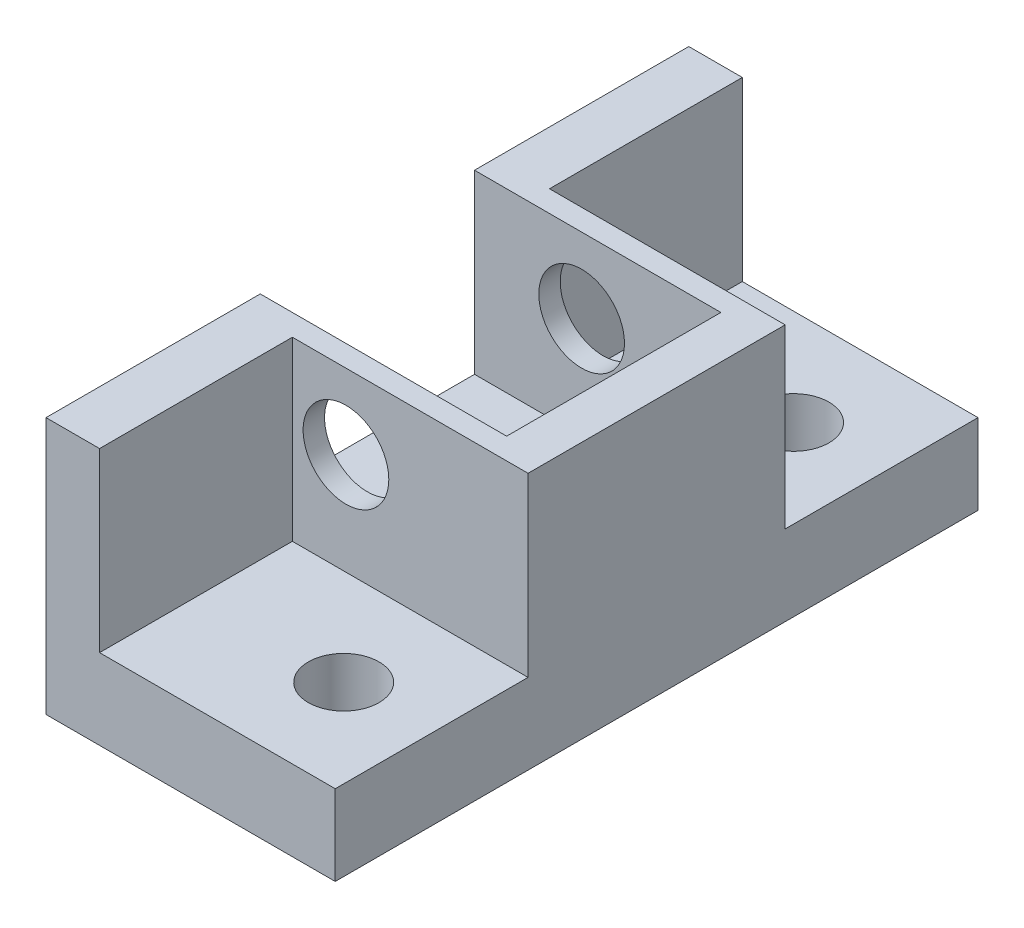
ISO-10303-21;
HEADER;
FILE_DESCRIPTION(('STEP AP214'),'2;1');
FILE_NAME('part.step','',(''),(''),'','','');
FILE_SCHEMA(('AUTOMOTIVE_DESIGN { 1 0 10303 214 1 1 1 1 }'));
ENDSEC;
DATA;
#1=APPLICATION_CONTEXT('core data for automotive mechanical design processes');
#2=APPLICATION_PROTOCOL_DEFINITION('international standard','automotive_design',2000,#1);
#3=PRODUCT_CONTEXT('',#1,'mechanical');
#4=PRODUCT('Part','Part','',(#3));
#5=PRODUCT_RELATED_PRODUCT_CATEGORY('part','',(#4));
#6=PRODUCT_DEFINITION_FORMATION('','',#4);
#7=PRODUCT_DEFINITION_CONTEXT('part definition',#1,'design');
#8=PRODUCT_DEFINITION('design','',#6,#7);
#9=PRODUCT_DEFINITION_SHAPE('','',#8);
#10=(LENGTH_UNIT() NAMED_UNIT(*) SI_UNIT(.MILLI.,.METRE.));
#11=(NAMED_UNIT(*) PLANE_ANGLE_UNIT() SI_UNIT($,.RADIAN.));
#12=(NAMED_UNIT(*) SI_UNIT($,.STERADIAN.) SOLID_ANGLE_UNIT());
#13=UNCERTAINTY_MEASURE_WITH_UNIT(LENGTH_MEASURE(1.E-05),#10,'distance_accuracy_value','');
#14=(GEOMETRIC_REPRESENTATION_CONTEXT(3) GLOBAL_UNCERTAINTY_ASSIGNED_CONTEXT((#13)) GLOBAL_UNIT_ASSIGNED_CONTEXT((#10,
#11,#12)) REPRESENTATION_CONTEXT('',''));
#15=CARTESIAN_POINT('',(0.,0.,0.));
#16=DIRECTION('',(0.,0.,1.));
#17=DIRECTION('',(1.,0.,0.));
#18=AXIS2_PLACEMENT_3D('',#15,#16,#17);
#19=CARTESIAN_POINT('',(0.,7.5,0.));
#20=DIRECTION('',(0.,1.,0.));
#21=DIRECTION('',(0.,0.,1.));
#22=AXIS2_PLACEMENT_3D('',#19,#20,#21);
#23=PLANE('',#22);
#24=DIRECTION('',(-1.,0.,0.));
#25=VECTOR('',#24,1.);
#26=CARTESIAN_POINT('',(9.50000000000001,7.5,9.99999999999999));
#27=LINE('',#26,#25);
#28=CARTESIAN_POINT('',(9.50000000000001,7.5,9.99999999999999));
#29=VERTEX_POINT('',#28);
#30=CARTESIAN_POINT('',(-13.5,7.5,9.99999999999999));
#31=VERTEX_POINT('',#30);
#32=EDGE_CURVE('E56',#29,#31,#27,.T.);
#33=ORIENTED_EDGE('',*,*,#32,.F.);
#34=DIRECTION('',(0.,0.,1.));
#35=VECTOR('',#34,1.);
#36=CARTESIAN_POINT('',(9.5,7.5,-10.));
#37=LINE('',#36,#35);
#38=CARTESIAN_POINT('',(9.5,7.5,-10.));
#39=VERTEX_POINT('',#38);
#40=EDGE_CURVE('E60',#39,#29,#37,.T.);
#41=ORIENTED_EDGE('',*,*,#40,.F.);
#42=DIRECTION('',(1.,0.,0.));
#43=VECTOR('',#42,1.);
#44=CARTESIAN_POINT('',(-13.5,7.5,-10.));
#45=LINE('',#44,#43);
#46=CARTESIAN_POINT('',(-13.5,7.5,-10.));
#47=VERTEX_POINT('',#46);
#48=EDGE_CURVE('E200',#47,#39,#45,.T.);
#49=ORIENTED_EDGE('',*,*,#48,.F.);
#50=DIRECTION('',(0.,0.,1.));
#51=VECTOR('',#50,1.);
#52=CARTESIAN_POINT('',(-13.5,7.5,30.));
#53=LINE('',#52,#51);
#54=EDGE_CURVE('E229',#47,#31,#53,.T.);
#55=ORIENTED_EDGE('',*,*,#54,.T.);
#56=EDGE_LOOP('',(#33,#41,#49,#55));
#57=FACE_BOUND('',#56,.T.);
#58=ADVANCED_FACE('F40',(#57),#23,.T.);
#59=CARTESIAN_POINT('',(5.28746824639353,7.5,-21.0000000000027));
#60=DIRECTION('',(0.,1.,0.));
#61=DIRECTION('',(0.,0.,-1.));
#62=AXIS2_PLACEMENT_3D('',#59,#60,#61);
#63=CIRCLE('',#62,3.3);
#64=CARTESIAN_POINT('',(5.28746824639353,7.5,-24.3000000000027));
#65=VERTEX_POINT('',#64);
#66=EDGE_CURVE('E320',#65,#65,#63,.T.);
#67=ORIENTED_EDGE('',*,*,#66,.F.);
#68=EDGE_LOOP('',(#67));
#69=FACE_BOUND('',#68,.T.);
#70=DIRECTION('',(0.,0.,-1.));
#71=VECTOR('',#70,1.);
#72=CARTESIAN_POINT('',(-8.5,7.5,-12.));
#73=LINE('',#72,#71);
#74=CARTESIAN_POINT('',(-8.5,7.5,-12.));
#75=VERTEX_POINT('',#74);
#76=CARTESIAN_POINT('',(-8.49999999999999,7.5,-30.));
#77=VERTEX_POINT('',#76);
#78=EDGE_CURVE('E197',#75,#77,#73,.T.);
#79=ORIENTED_EDGE('',*,*,#78,.F.);
#80=DIRECTION('',(-1.,0.,0.));
#81=VECTOR('',#80,1.);
#82=CARTESIAN_POINT('',(13.5,7.5,-12.));
#83=LINE('',#82,#81);
#84=CARTESIAN_POINT('',(13.5,7.5,-12.));
#85=VERTEX_POINT('',#84);
#86=EDGE_CURVE('E194',#85,#75,#83,.T.);
#87=ORIENTED_EDGE('',*,*,#86,.F.);
#88=DIRECTION('',(0.,0.,-1.));
#89=VECTOR('',#88,1.);
#90=CARTESIAN_POINT('',(13.5,7.5,30.));
#91=LINE('',#90,#89);
#92=CARTESIAN_POINT('',(13.5,7.5,-30.));
#93=VERTEX_POINT('',#92);
#94=EDGE_CURVE('E234',#85,#93,#91,.T.);
#95=ORIENTED_EDGE('',*,*,#94,.T.);
#96=DIRECTION('',(-1.,0.,0.));
#97=VECTOR('',#96,1.);
#98=CARTESIAN_POINT('',(13.5,7.5,-30.));
#99=LINE('',#98,#97);
#100=EDGE_CURVE('E237',#93,#77,#99,.T.);
#101=ORIENTED_EDGE('',*,*,#100,.T.);
#102=EDGE_LOOP('',(#79,#87,#95,#101));
#103=FACE_BOUND('',#102,.T.);
#104=ADVANCED_FACE('F275',(#69,#103),#23,.T.);
#105=CARTESIAN_POINT('',(-13.5,7.5,30.));
#106=DIRECTION('',(1.,0.,0.));
#107=DIRECTION('',(0.,0.,-1.));
#108=AXIS2_PLACEMENT_3D('',#105,#106,#107);
#109=PLANE('',#108);
#110=DIRECTION('',(0.,0.,1.));
#111=VECTOR('',#110,1.);
#112=CARTESIAN_POINT('',(-13.5,0.,30.));
#113=LINE('',#112,#111);
#114=CARTESIAN_POINT('',(-13.5,0.,-30.));
#115=VERTEX_POINT('',#114);
#116=CARTESIAN_POINT('',(-13.5,0.,30.));
#117=VERTEX_POINT('',#116);
#118=EDGE_CURVE('E146',#115,#117,#113,.T.);
#119=ORIENTED_EDGE('',*,*,#118,.T.);
#120=DIRECTION('',(0.,-1.,0.));
#121=VECTOR('',#120,1.);
#122=CARTESIAN_POINT('',(-13.5,7.5,30.));
#123=LINE('',#122,#121);
#124=CARTESIAN_POINT('',(-13.5,24.,30.));
#125=VERTEX_POINT('',#124);
#126=EDGE_CURVE('E11',#125,#117,#123,.T.);
#127=ORIENTED_EDGE('',*,*,#126,.F.);
#128=DIRECTION('',(0.,0.,1.));
#129=VECTOR('',#128,1.);
#130=CARTESIAN_POINT('',(-13.5,24.,9.99999999999999));
#131=LINE('',#130,#129);
#132=CARTESIAN_POINT('',(-13.5,24.,9.99999999999999));
#133=VERTEX_POINT('',#132);
#134=EDGE_CURVE('E143',#133,#125,#131,.T.);
#135=ORIENTED_EDGE('',*,*,#134,.F.);
#136=DIRECTION('',(0.,-1.,0.));
#137=VECTOR('',#136,1.);
#138=CARTESIAN_POINT('',(-13.5,24.,9.99999999999999));
#139=LINE('',#138,#137);
#140=EDGE_CURVE('E187',#133,#31,#139,.T.);
#141=ORIENTED_EDGE('',*,*,#140,.T.);
#142=ORIENTED_EDGE('',*,*,#54,.F.);
#143=DIRECTION('',(0.,-1.,0.));
#144=VECTOR('',#143,1.);
#145=CARTESIAN_POINT('',(-13.5,24.,-10.));
#146=LINE('',#145,#144);
#147=CARTESIAN_POINT('',(-13.5,24.,-10.));
#148=VERTEX_POINT('',#147);
#149=EDGE_CURVE('E210',#148,#47,#146,.T.);
#150=ORIENTED_EDGE('',*,*,#149,.F.);
#151=DIRECTION('',(0.,0.,1.));
#152=VECTOR('',#151,1.);
#153=CARTESIAN_POINT('',(-13.5,24.,-30.));
#154=LINE('',#153,#152);
#155=CARTESIAN_POINT('',(-13.5,24.,-30.));
#156=VERTEX_POINT('',#155);
#157=EDGE_CURVE('E180',#156,#148,#154,.T.);
#158=ORIENTED_EDGE('',*,*,#157,.F.);
#159=DIRECTION('',(0.,-1.,0.));
#160=VECTOR('',#159,1.);
#161=CARTESIAN_POINT('',(-13.5,7.5,-30.));
#162=LINE('',#161,#160);
#163=EDGE_CURVE('E239',#156,#115,#162,.T.);
#164=ORIENTED_EDGE('',*,*,#163,.T.);
#165=EDGE_LOOP('',(#119,#127,#135,#141,#142,#150,#158,#164));
#166=FACE_BOUND('',#165,.T.);
#167=ADVANCED_FACE('F42',(#166),#109,.F.);
#168=CARTESIAN_POINT('',(13.5,7.5,30.));
#169=DIRECTION('',(0.,0.,-1.));
#170=DIRECTION('',(-1.,0.,0.));
#171=AXIS2_PLACEMENT_3D('',#168,#169,#170);
#172=PLANE('',#171);
#173=DIRECTION('',(1.,0.,0.));
#174=VECTOR('',#173,1.);
#175=CARTESIAN_POINT('',(13.5,0.,30.));
#176=LINE('',#175,#174);
#177=CARTESIAN_POINT('',(13.5,0.,30.));
#178=VERTEX_POINT('',#177);
#179=EDGE_CURVE('E241',#117,#178,#176,.T.);
#180=ORIENTED_EDGE('',*,*,#179,.T.);
#181=DIRECTION('',(0.,-1.,0.));
#182=VECTOR('',#181,1.);
#183=CARTESIAN_POINT('',(13.5,7.5,30.));
#184=LINE('',#183,#182);
#185=CARTESIAN_POINT('',(13.5,7.5,30.));
#186=VERTEX_POINT('',#185);
#187=EDGE_CURVE('E49',#186,#178,#184,.T.);
#188=ORIENTED_EDGE('',*,*,#187,.F.);
#189=DIRECTION('',(1.,0.,0.));
#190=VECTOR('',#189,1.);
#191=CARTESIAN_POINT('',(13.5,7.5,30.));
#192=LINE('',#191,#190);
#193=CARTESIAN_POINT('',(-8.49999999999999,7.5,30.));
#194=VERTEX_POINT('',#193);
#195=EDGE_CURVE('E231',#194,#186,#192,.T.);
#196=ORIENTED_EDGE('',*,*,#195,.F.);
#197=DIRECTION('',(0.,-1.,0.));
#198=VECTOR('',#197,1.);
#199=CARTESIAN_POINT('',(-8.5,24.,30.));
#200=LINE('',#199,#198);
#201=CARTESIAN_POINT('',(-8.5,24.,30.));
#202=VERTEX_POINT('',#201);
#203=EDGE_CURVE('E153',#202,#194,#200,.T.);
#204=ORIENTED_EDGE('',*,*,#203,.F.);
#205=DIRECTION('',(1.,0.,0.));
#206=VECTOR('',#205,1.);
#207=CARTESIAN_POINT('',(-13.5,24.,30.));
#208=LINE('',#207,#206);
#209=EDGE_CURVE('E149',#125,#202,#208,.T.);
#210=ORIENTED_EDGE('',*,*,#209,.F.);
#211=ORIENTED_EDGE('',*,*,#126,.T.);
#212=EDGE_LOOP('',(#180,#188,#196,#204,#210,#211));
#213=FACE_BOUND('',#212,.T.);
#214=ADVANCED_FACE('F150',(#213),#172,.F.);
#215=CARTESIAN_POINT('',(13.5,7.5,30.));
#216=DIRECTION('',(-1.,0.,0.));
#217=DIRECTION('',(0.,0.,1.));
#218=AXIS2_PLACEMENT_3D('',#215,#216,#217);
#219=PLANE('',#218);
#220=DIRECTION('',(0.,0.,-1.));
#221=VECTOR('',#220,1.);
#222=CARTESIAN_POINT('',(13.5,0.,30.));
#223=LINE('',#222,#221);
#224=CARTESIAN_POINT('',(13.5,0.,-30.));
#225=VERTEX_POINT('',#224);
#226=EDGE_CURVE('E243',#178,#225,#223,.T.);
#227=ORIENTED_EDGE('',*,*,#226,.T.);
#228=DIRECTION('',(0.,-1.,0.));
#229=VECTOR('',#228,1.);
#230=CARTESIAN_POINT('',(13.5,7.5,-30.));
#231=LINE('',#230,#229);
#232=EDGE_CURVE('E247',#93,#225,#231,.T.);
#233=ORIENTED_EDGE('',*,*,#232,.F.);
#234=ORIENTED_EDGE('',*,*,#94,.F.);
#235=DIRECTION('',(0.,-1.,0.));
#236=VECTOR('',#235,1.);
#237=CARTESIAN_POINT('',(13.5,24.,-12.));
#238=LINE('',#237,#236);
#239=CARTESIAN_POINT('',(13.5,24.,-12.));
#240=VERTEX_POINT('',#239);
#241=EDGE_CURVE('E219',#240,#85,#238,.T.);
#242=ORIENTED_EDGE('',*,*,#241,.F.);
#243=DIRECTION('',(0.,0.,-1.));
#244=VECTOR('',#243,1.);
#245=CARTESIAN_POINT('',(13.5,24.,12.));
#246=LINE('',#245,#244);
#247=CARTESIAN_POINT('',(13.5,24.,12.));
#248=VERTEX_POINT('',#247);
#249=EDGE_CURVE('E171',#248,#240,#246,.T.);
#250=ORIENTED_EDGE('',*,*,#249,.F.);
#251=DIRECTION('',(0.,-1.,0.));
#252=VECTOR('',#251,1.);
#253=CARTESIAN_POINT('',(13.5,24.,12.));
#254=LINE('',#253,#252);
#255=CARTESIAN_POINT('',(13.5,7.5,12.));
#256=VERTEX_POINT('',#255);
#257=EDGE_CURVE('E222',#248,#256,#254,.T.);
#258=ORIENTED_EDGE('',*,*,#257,.T.);
#259=EDGE_CURVE('E235',#186,#256,#91,.T.);
#260=ORIENTED_EDGE('',*,*,#259,.F.);
#261=ORIENTED_EDGE('',*,*,#187,.T.);
#262=EDGE_LOOP('',(#227,#233,#234,#242,#250,#258,#260,#261));
#263=FACE_BOUND('',#262,.T.);
#264=ADVANCED_FACE('F255',(#263),#219,.F.);
#265=CARTESIAN_POINT('',(13.5,7.5,-30.));
#266=DIRECTION('',(0.,0.,1.));
#267=DIRECTION('',(1.,0.,0.));
#268=AXIS2_PLACEMENT_3D('',#265,#266,#267);
#269=PLANE('',#268);
#270=DIRECTION('',(-1.,0.,0.));
#271=VECTOR('',#270,1.);
#272=CARTESIAN_POINT('',(13.5,0.,-30.));
#273=LINE('',#272,#271);
#274=EDGE_CURVE('E232',#225,#115,#273,.T.);
#275=ORIENTED_EDGE('',*,*,#274,.T.);
#276=ORIENTED_EDGE('',*,*,#163,.F.);
#277=DIRECTION('',(-1.,0.,0.));
#278=VECTOR('',#277,1.);
#279=CARTESIAN_POINT('',(-8.5,24.,-30.));
#280=LINE('',#279,#278);
#281=CARTESIAN_POINT('',(-8.5,24.,-30.));
#282=VERTEX_POINT('',#281);
#283=EDGE_CURVE('E177',#282,#156,#280,.T.);
#284=ORIENTED_EDGE('',*,*,#283,.F.);
#285=DIRECTION('',(0.,-1.,0.));
#286=VECTOR('',#285,1.);
#287=CARTESIAN_POINT('',(-8.5,24.,-30.));
#288=LINE('',#287,#286);
#289=EDGE_CURVE('E213',#282,#77,#288,.T.);
#290=ORIENTED_EDGE('',*,*,#289,.T.);
#291=ORIENTED_EDGE('',*,*,#100,.F.);
#292=ORIENTED_EDGE('',*,*,#232,.T.);
#293=EDGE_LOOP('',(#275,#276,#284,#290,#291,#292));
#294=FACE_BOUND('',#293,.T.);
#295=ADVANCED_FACE('F261',(#294),#269,.F.);
#296=CARTESIAN_POINT('',(5.28746824639353,7.5,21.0000000000027));
#297=DIRECTION('',(0.,1.,0.));
#298=DIRECTION('',(0.,0.,1.));
#299=AXIS2_PLACEMENT_3D('',#296,#297,#298);
#300=CIRCLE('',#299,3.3);
#301=CARTESIAN_POINT('',(5.28746824639353,7.5,24.3000000000027));
#302=VERTEX_POINT('',#301);
#303=EDGE_CURVE('E317',#302,#302,#300,.T.);
#304=ORIENTED_EDGE('',*,*,#303,.F.);
#305=EDGE_LOOP('',(#304));
#306=FACE_BOUND('',#305,.T.);
#307=DIRECTION('',(1.,0.,0.));
#308=VECTOR('',#307,1.);
#309=CARTESIAN_POINT('',(13.5,7.5,12.));
#310=LINE('',#309,#308);
#311=CARTESIAN_POINT('',(-8.5,7.5,12.));
#312=VERTEX_POINT('',#311);
#313=EDGE_CURVE('E191',#312,#256,#310,.T.);
#314=ORIENTED_EDGE('',*,*,#313,.F.);
#315=DIRECTION('',(0.,0.,-1.));
#316=VECTOR('',#315,1.);
#317=CARTESIAN_POINT('',(-8.5,7.5,30.));
#318=LINE('',#317,#316);
#319=EDGE_CURVE('E188',#194,#312,#318,.T.);
#320=ORIENTED_EDGE('',*,*,#319,.F.);
#321=ORIENTED_EDGE('',*,*,#195,.T.);
#322=ORIENTED_EDGE('',*,*,#259,.T.);
#323=EDGE_LOOP('',(#314,#320,#321,#322));
#324=FACE_BOUND('',#323,.T.);
#325=ADVANCED_FACE('F288',(#306,#324),#23,.T.);
#326=CARTESIAN_POINT('',(0.,0.,0.));
#327=DIRECTION('',(0.,1.,0.));
#328=DIRECTION('',(0.,0.,1.));
#329=AXIS2_PLACEMENT_3D('',#326,#327,#328);
#330=PLANE('',#329);
#331=CARTESIAN_POINT('',(5.28746824639353,0.,21.0000000000027));
#332=DIRECTION('',(0.,1.,0.));
#333=DIRECTION('',(0.,0.,1.));
#334=AXIS2_PLACEMENT_3D('',#331,#332,#333);
#335=CIRCLE('',#334,3.3);
#336=CARTESIAN_POINT('',(5.28746824639353,0.,24.3000000000027));
#337=VERTEX_POINT('',#336);
#338=EDGE_CURVE('E319',#337,#337,#335,.T.);
#339=ORIENTED_EDGE('',*,*,#338,.T.);
#340=EDGE_LOOP('',(#339));
#341=FACE_BOUND('',#340,.T.);
#342=CARTESIAN_POINT('',(5.28746824639353,0.,-21.0000000000027));
#343=DIRECTION('',(0.,1.,0.));
#344=DIRECTION('',(0.,0.,-1.));
#345=AXIS2_PLACEMENT_3D('',#342,#343,#344);
#346=CIRCLE('',#345,3.3);
#347=CARTESIAN_POINT('',(5.28746824639353,0.,-24.3000000000027));
#348=VERTEX_POINT('',#347);
#349=EDGE_CURVE('E326',#348,#348,#346,.T.);
#350=ORIENTED_EDGE('',*,*,#349,.T.);
#351=EDGE_LOOP('',(#350));
#352=FACE_BOUND('',#351,.T.);
#353=ORIENTED_EDGE('',*,*,#118,.F.);
#354=ORIENTED_EDGE('',*,*,#274,.F.);
#355=ORIENTED_EDGE('',*,*,#226,.F.);
#356=ORIENTED_EDGE('',*,*,#179,.F.);
#357=EDGE_LOOP('',(#353,#354,#355,#356));
#358=FACE_BOUND('',#357,.T.);
#359=ADVANCED_FACE('F259',(#341,#352,#358),#330,.F.);
#360=CARTESIAN_POINT('',(-8.5,24.,30.));
#361=DIRECTION('',(-1.,0.,0.));
#362=DIRECTION('',(0.,0.,1.));
#363=AXIS2_PLACEMENT_3D('',#360,#361,#362);
#364=PLANE('',#363);
#365=ORIENTED_EDGE('',*,*,#319,.T.);
#366=DIRECTION('',(0.,-1.,0.));
#367=VECTOR('',#366,1.);
#368=CARTESIAN_POINT('',(-8.5,24.,12.));
#369=LINE('',#368,#367);
#370=CARTESIAN_POINT('',(-8.5,24.,12.));
#371=VERTEX_POINT('',#370);
#372=EDGE_CURVE('E225',#371,#312,#369,.T.);
#373=ORIENTED_EDGE('',*,*,#372,.F.);
#374=DIRECTION('',(0.,0.,-1.));
#375=VECTOR('',#374,1.);
#376=CARTESIAN_POINT('',(-8.5,24.,30.));
#377=LINE('',#376,#375);
#378=EDGE_CURVE('E156',#202,#371,#377,.T.);
#379=ORIENTED_EDGE('',*,*,#378,.F.);
#380=ORIENTED_EDGE('',*,*,#203,.T.);
#381=EDGE_LOOP('',(#365,#373,#379,#380));
#382=FACE_BOUND('',#381,.T.);
#383=ADVANCED_FACE('F290',(#382),#364,.F.);
#384=CARTESIAN_POINT('',(13.5,24.,12.));
#385=DIRECTION('',(0.,0.,-1.));
#386=DIRECTION('',(-1.,0.,0.));
#387=AXIS2_PLACEMENT_3D('',#384,#385,#386);
#388=PLANE('',#387);
#389=CARTESIAN_POINT('',(-3.5,17.,12.));
#390=DIRECTION('',(0.,0.,1.));
#391=DIRECTION('',(1.,0.,0.));
#392=AXIS2_PLACEMENT_3D('',#389,#390,#391);
#393=CIRCLE('',#392,4.);
#394=CARTESIAN_POINT('',(0.500000000000003,17.,12.));
#395=VERTEX_POINT('',#394);
#396=EDGE_CURVE('E323',#395,#395,#393,.T.);
#397=ORIENTED_EDGE('',*,*,#396,.F.);
#398=EDGE_LOOP('',(#397));
#399=FACE_BOUND('',#398,.T.);
#400=ORIENTED_EDGE('',*,*,#313,.T.);
#401=ORIENTED_EDGE('',*,*,#257,.F.);
#402=DIRECTION('',(1.,0.,0.));
#403=VECTOR('',#402,1.);
#404=CARTESIAN_POINT('',(13.5,24.,12.));
#405=LINE('',#404,#403);
#406=EDGE_CURVE('E169',#371,#248,#405,.T.);
#407=ORIENTED_EDGE('',*,*,#406,.F.);
#408=ORIENTED_EDGE('',*,*,#372,.T.);
#409=EDGE_LOOP('',(#400,#401,#407,#408));
#410=FACE_BOUND('',#409,.T.);
#411=ADVANCED_FACE('F286',(#399,#410),#388,.F.);
#412=CARTESIAN_POINT('',(13.5,24.,-12.));
#413=DIRECTION('',(0.,0.,1.));
#414=DIRECTION('',(1.,0.,0.));
#415=AXIS2_PLACEMENT_3D('',#412,#413,#414);
#416=PLANE('',#415);
#417=CARTESIAN_POINT('',(-3.5,17.,-12.));
#418=DIRECTION('',(0.,0.,1.));
#419=DIRECTION('',(1.,0.,0.));
#420=AXIS2_PLACEMENT_3D('',#417,#418,#419);
#421=CIRCLE('',#420,4.);
#422=CARTESIAN_POINT('',(0.500000000000003,17.,-12.));
#423=VERTEX_POINT('',#422);
#424=EDGE_CURVE('E165',#423,#423,#421,.T.);
#425=ORIENTED_EDGE('',*,*,#424,.T.);
#426=EDGE_LOOP('',(#425));
#427=FACE_BOUND('',#426,.T.);
#428=ORIENTED_EDGE('',*,*,#86,.T.);
#429=DIRECTION('',(0.,-1.,0.));
#430=VECTOR('',#429,1.);
#431=CARTESIAN_POINT('',(-8.5,24.,-12.));
#432=LINE('',#431,#430);
#433=CARTESIAN_POINT('',(-8.5,24.,-12.));
#434=VERTEX_POINT('',#433);
#435=EDGE_CURVE('E216',#434,#75,#432,.T.);
#436=ORIENTED_EDGE('',*,*,#435,.F.);
#437=DIRECTION('',(-1.,0.,0.));
#438=VECTOR('',#437,1.);
#439=CARTESIAN_POINT('',(13.5,24.,-12.));
#440=LINE('',#439,#438);
#441=EDGE_CURVE('E173',#240,#434,#440,.T.);
#442=ORIENTED_EDGE('',*,*,#441,.F.);
#443=ORIENTED_EDGE('',*,*,#241,.T.);
#444=EDGE_LOOP('',(#428,#436,#442,#443));
#445=FACE_BOUND('',#444,.T.);
#446=ADVANCED_FACE('F278',(#427,#445),#416,.F.);
#447=CARTESIAN_POINT('',(-8.5,24.,-12.));
#448=DIRECTION('',(-1.,0.,0.));
#449=DIRECTION('',(0.,0.,1.));
#450=AXIS2_PLACEMENT_3D('',#447,#448,#449);
#451=PLANE('',#450);
#452=ORIENTED_EDGE('',*,*,#78,.T.);
#453=ORIENTED_EDGE('',*,*,#289,.F.);
#454=DIRECTION('',(0.,0.,-1.));
#455=VECTOR('',#454,1.);
#456=CARTESIAN_POINT('',(-8.5,24.,-12.));
#457=LINE('',#456,#455);
#458=EDGE_CURVE('E175',#434,#282,#457,.T.);
#459=ORIENTED_EDGE('',*,*,#458,.F.);
#460=ORIENTED_EDGE('',*,*,#435,.T.);
#461=EDGE_LOOP('',(#452,#453,#459,#460));
#462=FACE_BOUND('',#461,.T.);
#463=ADVANCED_FACE('F272',(#462),#451,.F.);
#464=CARTESIAN_POINT('',(-13.5,24.,-10.));
#465=DIRECTION('',(0.,0.,-1.));
#466=DIRECTION('',(-1.,0.,0.));
#467=AXIS2_PLACEMENT_3D('',#464,#465,#466);
#468=PLANE('',#467);
#469=CARTESIAN_POINT('',(-3.5,17.,-10.));
#470=DIRECTION('',(0.,0.,-1.));
#471=DIRECTION('',(-1.,0.,0.));
#472=AXIS2_PLACEMENT_3D('',#469,#470,#471);
#473=CIRCLE('',#472,4.);
#474=CARTESIAN_POINT('',(0.500000000000003,17.,-10.));
#475=VERTEX_POINT('',#474);
#476=EDGE_CURVE('E332',#475,#475,#473,.T.);
#477=ORIENTED_EDGE('',*,*,#476,.T.);
#478=EDGE_LOOP('',(#477));
#479=FACE_BOUND('',#478,.T.);
#480=ORIENTED_EDGE('',*,*,#48,.T.);
#481=DIRECTION('',(0.,-1.,0.));
#482=VECTOR('',#481,1.);
#483=CARTESIAN_POINT('',(9.5,24.,-10.));
#484=LINE('',#483,#482);
#485=CARTESIAN_POINT('',(9.5,24.,-10.));
#486=VERTEX_POINT('',#485);
#487=EDGE_CURVE('E207',#486,#39,#484,.T.);
#488=ORIENTED_EDGE('',*,*,#487,.F.);
#489=DIRECTION('',(1.,0.,0.));
#490=VECTOR('',#489,1.);
#491=CARTESIAN_POINT('',(-13.5,24.,-10.));
#492=LINE('',#491,#490);
#493=EDGE_CURVE('E182',#148,#486,#492,.T.);
#494=ORIENTED_EDGE('',*,*,#493,.F.);
#495=ORIENTED_EDGE('',*,*,#149,.T.);
#496=EDGE_LOOP('',(#480,#488,#494,#495));
#497=FACE_BOUND('',#496,.T.);
#498=ADVANCED_FACE('F363',(#479,#497),#468,.F.);
#499=CARTESIAN_POINT('',(9.5,24.,-10.));
#500=DIRECTION('',(1.,0.,0.));
#501=DIRECTION('',(0.,0.,-1.));
#502=AXIS2_PLACEMENT_3D('',#499,#500,#501);
#503=PLANE('',#502);
#504=ORIENTED_EDGE('',*,*,#40,.T.);
#505=DIRECTION('',(0.,-1.,0.));
#506=VECTOR('',#505,1.);
#507=CARTESIAN_POINT('',(9.50000000000001,24.,9.99999999999999));
#508=LINE('',#507,#506);
#509=CARTESIAN_POINT('',(9.50000000000001,24.,9.99999999999999));
#510=VERTEX_POINT('',#509);
#511=EDGE_CURVE('E204',#510,#29,#508,.T.);
#512=ORIENTED_EDGE('',*,*,#511,.F.);
#513=DIRECTION('',(0.,0.,1.));
#514=VECTOR('',#513,1.);
#515=CARTESIAN_POINT('',(9.5,24.,-10.));
#516=LINE('',#515,#514);
#517=EDGE_CURVE('E184',#486,#510,#516,.T.);
#518=ORIENTED_EDGE('',*,*,#517,.F.);
#519=ORIENTED_EDGE('',*,*,#487,.T.);
#520=EDGE_LOOP('',(#504,#512,#518,#519));
#521=FACE_BOUND('',#520,.T.);
#522=ADVANCED_FACE('F360',(#521),#503,.F.);
#523=CARTESIAN_POINT('',(9.50000000000001,24.,9.99999999999999));
#524=DIRECTION('',(0.,0.,1.));
#525=DIRECTION('',(1.,0.,0.));
#526=AXIS2_PLACEMENT_3D('',#523,#524,#525);
#527=PLANE('',#526);
#528=CARTESIAN_POINT('',(-3.5,17.,9.99999999999999));
#529=DIRECTION('',(0.,0.,1.));
#530=DIRECTION('',(1.,0.,0.));
#531=AXIS2_PLACEMENT_3D('',#528,#529,#530);
#532=CIRCLE('',#531,4.);
#533=CARTESIAN_POINT('',(0.500000000000003,17.,9.99999999999998));
#534=VERTEX_POINT('',#533);
#535=EDGE_CURVE('E44',#534,#534,#532,.T.);
#536=ORIENTED_EDGE('',*,*,#535,.T.);
#537=EDGE_LOOP('',(#536));
#538=FACE_BOUND('',#537,.T.);
#539=ORIENTED_EDGE('',*,*,#32,.T.);
#540=ORIENTED_EDGE('',*,*,#140,.F.);
#541=DIRECTION('',(-1.,0.,0.));
#542=VECTOR('',#541,1.);
#543=CARTESIAN_POINT('',(9.50000000000001,24.,9.99999999999999));
#544=LINE('',#543,#542);
#545=EDGE_CURVE('E160',#510,#133,#544,.T.);
#546=ORIENTED_EDGE('',*,*,#545,.F.);
#547=ORIENTED_EDGE('',*,*,#511,.T.);
#548=EDGE_LOOP('',(#539,#540,#546,#547));
#549=FACE_BOUND('',#548,.T.);
#550=ADVANCED_FACE('F340',(#538,#549),#527,.F.);
#551=CARTESIAN_POINT('',(0.,24.,0.));
#552=DIRECTION('',(0.,1.,0.));
#553=DIRECTION('',(0.,0.,1.));
#554=AXIS2_PLACEMENT_3D('',#551,#552,#553);
#555=PLANE('',#554);
#556=ORIENTED_EDGE('',*,*,#134,.T.);
#557=ORIENTED_EDGE('',*,*,#209,.T.);
#558=ORIENTED_EDGE('',*,*,#378,.T.);
#559=ORIENTED_EDGE('',*,*,#406,.T.);
#560=ORIENTED_EDGE('',*,*,#249,.T.);
#561=ORIENTED_EDGE('',*,*,#441,.T.);
#562=ORIENTED_EDGE('',*,*,#458,.T.);
#563=ORIENTED_EDGE('',*,*,#283,.T.);
#564=ORIENTED_EDGE('',*,*,#157,.T.);
#565=ORIENTED_EDGE('',*,*,#493,.T.);
#566=ORIENTED_EDGE('',*,*,#517,.T.);
#567=ORIENTED_EDGE('',*,*,#545,.T.);
#568=EDGE_LOOP('',(#556,#557,#558,#559,#560,#561,#562,#563,#564,#565,#566,#567));
#569=FACE_BOUND('',#568,.T.);
#570=ADVANCED_FACE('F158',(#569),#555,.T.);
#571=CARTESIAN_POINT('',(-3.5,17.,-30.));
#572=DIRECTION('',(0.,0.,1.));
#573=DIRECTION('',(1.,0.,0.));
#574=AXIS2_PLACEMENT_3D('',#571,#572,#573);
#575=CYLINDRICAL_SURFACE('',#574,4.);
#576=CARTESIAN_POINT('',(0.500000000000003,17.,12.));
#577=CARTESIAN_POINT('',(0.500000000000003,17.,11.9791666666667));
#578=CARTESIAN_POINT('',(0.500000000000003,17.,11.9583333333333));
#579=CARTESIAN_POINT('',(0.500000000000003,17.,11.9166666666667));
#580=CARTESIAN_POINT('',(0.500000000000003,17.,11.8958333333333));
#581=CARTESIAN_POINT('',(0.500000000000003,17.,11.8541666666667));
#582=CARTESIAN_POINT('',(0.500000000000003,17.,11.8333333333333));
#583=CARTESIAN_POINT('',(0.500000000000003,17.,11.7916666666667));
#584=CARTESIAN_POINT('',(0.500000000000003,17.,11.7708333333333));
#585=CARTESIAN_POINT('',(0.500000000000003,17.,11.7291666666667));
#586=CARTESIAN_POINT('',(0.500000000000003,17.,11.7083333333333));
#587=CARTESIAN_POINT('',(0.500000000000003,17.,11.6666666666667));
#588=CARTESIAN_POINT('',(0.500000000000003,17.,11.6458333333333));
#589=CARTESIAN_POINT('',(0.500000000000003,17.,11.6041666666667));
#590=CARTESIAN_POINT('',(0.500000000000003,17.,11.5833333333333));
#591=CARTESIAN_POINT('',(0.500000000000003,17.,11.5416666666667));
#592=CARTESIAN_POINT('',(0.500000000000003,17.,11.5208333333333));
#593=CARTESIAN_POINT('',(0.500000000000003,17.,11.4791666666667));
#594=CARTESIAN_POINT('',(0.500000000000003,17.,11.4583333333333));
#595=CARTESIAN_POINT('',(0.500000000000003,17.,11.4166666666667));
#596=CARTESIAN_POINT('',(0.500000000000003,17.,11.3958333333333));
#597=CARTESIAN_POINT('',(0.500000000000003,17.,11.3541666666667));
#598=CARTESIAN_POINT('',(0.500000000000003,17.,11.3333333333333));
#599=CARTESIAN_POINT('',(0.500000000000003,17.,11.2916666666667));
#600=CARTESIAN_POINT('',(0.500000000000003,17.,11.2708333333333));
#601=CARTESIAN_POINT('',(0.500000000000003,17.,11.2291666666667));
#602=CARTESIAN_POINT('',(0.500000000000003,17.,11.2083333333333));
#603=CARTESIAN_POINT('',(0.500000000000003,17.,11.1666666666667));
#604=CARTESIAN_POINT('',(0.500000000000003,17.,11.1458333333333));
#605=CARTESIAN_POINT('',(0.500000000000003,17.,11.1041666666667));
#606=CARTESIAN_POINT('',(0.500000000000003,17.,11.0833333333333));
#607=CARTESIAN_POINT('',(0.500000000000003,17.,11.0416666666667));
#608=CARTESIAN_POINT('',(0.500000000000003,17.,11.0208333333333));
#609=CARTESIAN_POINT('',(0.500000000000003,17.,10.9791666666667));
#610=CARTESIAN_POINT('',(0.500000000000003,17.,10.9583333333333));
#611=CARTESIAN_POINT('',(0.500000000000003,17.,10.9166666666667));
#612=CARTESIAN_POINT('',(0.500000000000003,17.,10.8958333333333));
#613=CARTESIAN_POINT('',(0.500000000000003,17.,10.8541666666667));
#614=CARTESIAN_POINT('',(0.500000000000003,17.,10.8333333333333));
#615=CARTESIAN_POINT('',(0.500000000000003,17.,10.7916666666667));
#616=CARTESIAN_POINT('',(0.500000000000003,17.,10.7708333333333));
#617=CARTESIAN_POINT('',(0.500000000000003,17.,10.7291666666667));
#618=CARTESIAN_POINT('',(0.500000000000003,17.,10.7083333333333));
#619=CARTESIAN_POINT('',(0.500000000000003,17.,10.6666666666667));
#620=CARTESIAN_POINT('',(0.500000000000003,17.,10.6458333333333));
#621=CARTESIAN_POINT('',(0.500000000000003,17.,10.6041666666667));
#622=CARTESIAN_POINT('',(0.500000000000003,17.,10.5833333333333));
#623=CARTESIAN_POINT('',(0.500000000000003,17.,10.5416666666667));
#624=CARTESIAN_POINT('',(0.500000000000003,17.,10.5208333333333));
#625=CARTESIAN_POINT('',(0.500000000000003,17.,10.4791666666666));
#626=CARTESIAN_POINT('',(0.500000000000003,17.,10.4583333333333));
#627=CARTESIAN_POINT('',(0.500000000000003,17.,10.4166666666666));
#628=CARTESIAN_POINT('',(0.500000000000003,17.,10.3958333333333));
#629=CARTESIAN_POINT('',(0.500000000000003,17.,10.3541666666666));
#630=CARTESIAN_POINT('',(0.500000000000003,17.,10.3333333333333));
#631=CARTESIAN_POINT('',(0.500000000000003,17.,10.2916666666666));
#632=CARTESIAN_POINT('',(0.500000000000003,17.,10.2708333333333));
#633=CARTESIAN_POINT('',(0.500000000000003,17.,10.2291666666666));
#634=CARTESIAN_POINT('',(0.500000000000003,17.,10.2083333333333));
#635=CARTESIAN_POINT('',(0.500000000000003,17.,10.1666666666666));
#636=CARTESIAN_POINT('',(0.500000000000003,17.,10.1458333333333));
#637=CARTESIAN_POINT('',(0.500000000000003,17.,10.1041666666666));
#638=CARTESIAN_POINT('',(0.500000000000003,17.,10.0833333333333));
#639=CARTESIAN_POINT('',(0.500000000000003,17.,10.0416666666666));
#640=CARTESIAN_POINT('',(0.500000000000003,17.,10.0208333333333));
#641=CARTESIAN_POINT('',(0.500000000000003,17.,9.99999999999998));
#642=B_SPLINE_CURVE_WITH_KNOTS('',3,(#576,#577,#578,#579,#580,#581,#582,#583,#584,#585,#586,
#587,#588,#589,#590,#591,#592,#593,#594,#595,#596,#597,#598,#599,#600,#601,#602,#603,#604,#605,
#606,#607,#608,#609,#610,#611,#612,#613,#614,#615,#616,#617,#618,#619,#620,#621,#622,#623,#624,
#625,#626,#627,#628,#629,#630,#631,#632,#633,#634,#635,#636,#637,#638,#639,#640,#641),
.UNSPECIFIED.,.F.,.F.,(4,2,2,2,2,2,2,2,2,2,2,2,2,2,2,2,2,2,2,2,2,2,2,2,2,2,2,2,2,2,2,2,4),(0.,
0.0625000000000001,0.125,0.1875,0.25,0.3125,0.375,0.4375,0.5,0.562500000000007,
0.625000000000008,0.687500000000008,0.750000000000008,0.812500000000008,0.875000000000008,
0.937500000000008,1.00000000000001,1.06250000000001,1.12500000000001,1.18750000000001,
1.25000000000001,1.31250000000001,1.37500000000001,1.43750000000001,1.50000000000002,
1.56250000000002,1.62500000000002,1.68750000000002,1.75000000000002,1.81250000000002,
1.87500000000002,1.93750000000002,2.00000000000002),.UNSPECIFIED.);
#643=EDGE_CURVE('BSEAM343',#395,#534,#642,.T.);
#644=ORIENTED_EDGE('',*,*,#396,.T.);
#645=ORIENTED_EDGE('',*,*,#535,.F.);
#646=ORIENTED_EDGE('',*,*,#643,.T.);
#647=ORIENTED_EDGE('',*,*,#643,.F.);
#648=EDGE_LOOP('',(#644,#646,#645,#647));
#649=FACE_BOUND('',#648,.T.);
#650=ADVANCED_FACE('F343',(#649),#575,.F.);
#651=CARTESIAN_POINT('',(0.500000000000003,17.,-10.));
#652=CARTESIAN_POINT('',(0.500000000000003,17.,-10.0208333333333));
#653=CARTESIAN_POINT('',(0.500000000000003,17.,-10.0416666666667));
#654=CARTESIAN_POINT('',(0.500000000000003,17.,-10.0833333333333));
#655=CARTESIAN_POINT('',(0.500000000000003,17.,-10.1041666666667));
#656=CARTESIAN_POINT('',(0.500000000000003,17.,-10.1458333333333));
#657=CARTESIAN_POINT('',(0.500000000000003,17.,-10.1666666666667));
#658=CARTESIAN_POINT('',(0.500000000000003,17.,-10.2083333333333));
#659=CARTESIAN_POINT('',(0.500000000000003,17.,-10.2291666666667));
#660=CARTESIAN_POINT('',(0.500000000000003,17.,-10.2708333333333));
#661=CARTESIAN_POINT('',(0.500000000000003,17.,-10.2916666666667));
#662=CARTESIAN_POINT('',(0.500000000000003,17.,-10.3333333333333));
#663=CARTESIAN_POINT('',(0.500000000000003,17.,-10.3541666666667));
#664=CARTESIAN_POINT('',(0.500000000000003,17.,-10.3958333333333));
#665=CARTESIAN_POINT('',(0.500000000000003,17.,-10.4166666666667));
#666=CARTESIAN_POINT('',(0.500000000000003,17.,-10.4583333333333));
#667=CARTESIAN_POINT('',(0.500000000000003,17.,-10.4791666666667));
#668=CARTESIAN_POINT('',(0.500000000000003,17.,-10.5208333333333));
#669=CARTESIAN_POINT('',(0.500000000000003,17.,-10.5416666666667));
#670=CARTESIAN_POINT('',(0.500000000000003,17.,-10.5833333333333));
#671=CARTESIAN_POINT('',(0.500000000000003,17.,-10.6041666666667));
#672=CARTESIAN_POINT('',(0.500000000000003,17.,-10.6458333333333));
#673=CARTESIAN_POINT('',(0.500000000000003,17.,-10.6666666666667));
#674=CARTESIAN_POINT('',(0.500000000000003,17.,-10.7083333333333));
#675=CARTESIAN_POINT('',(0.500000000000003,17.,-10.7291666666667));
#676=CARTESIAN_POINT('',(0.500000000000003,17.,-10.7708333333333));
#677=CARTESIAN_POINT('',(0.500000000000003,17.,-10.7916666666667));
#678=CARTESIAN_POINT('',(0.500000000000003,17.,-10.8333333333333));
#679=CARTESIAN_POINT('',(0.500000000000003,17.,-10.8541666666667));
#680=CARTESIAN_POINT('',(0.500000000000003,17.,-10.8958333333333));
#681=CARTESIAN_POINT('',(0.500000000000003,17.,-10.9166666666667));
#682=CARTESIAN_POINT('',(0.500000000000003,17.,-10.9583333333333));
#683=CARTESIAN_POINT('',(0.500000000000003,17.,-10.9791666666667));
#684=CARTESIAN_POINT('',(0.500000000000003,17.,-11.0208333333333));
#685=CARTESIAN_POINT('',(0.500000000000003,17.,-11.0416666666667));
#686=CARTESIAN_POINT('',(0.500000000000003,17.,-11.0833333333333));
#687=CARTESIAN_POINT('',(0.500000000000003,17.,-11.1041666666667));
#688=CARTESIAN_POINT('',(0.500000000000003,17.,-11.1458333333333));
#689=CARTESIAN_POINT('',(0.500000000000003,17.,-11.1666666666667));
#690=CARTESIAN_POINT('',(0.500000000000003,17.,-11.2083333333333));
#691=CARTESIAN_POINT('',(0.500000000000003,17.,-11.2291666666667));
#692=CARTESIAN_POINT('',(0.500000000000003,17.,-11.2708333333333));
#693=CARTESIAN_POINT('',(0.500000000000003,17.,-11.2916666666667));
#694=CARTESIAN_POINT('',(0.500000000000003,17.,-11.3333333333333));
#695=CARTESIAN_POINT('',(0.500000000000003,17.,-11.3541666666667));
#696=CARTESIAN_POINT('',(0.500000000000003,17.,-11.3958333333333));
#697=CARTESIAN_POINT('',(0.500000000000003,17.,-11.4166666666667));
#698=CARTESIAN_POINT('',(0.500000000000003,17.,-11.4583333333333));
#699=CARTESIAN_POINT('',(0.500000000000003,17.,-11.4791666666667));
#700=CARTESIAN_POINT('',(0.500000000000003,17.,-11.5208333333333));
#701=CARTESIAN_POINT('',(0.500000000000003,17.,-11.5416666666667));
#702=CARTESIAN_POINT('',(0.500000000000003,17.,-11.5833333333333));
#703=CARTESIAN_POINT('',(0.500000000000003,17.,-11.6041666666667));
#704=CARTESIAN_POINT('',(0.500000000000003,17.,-11.6458333333333));
#705=CARTESIAN_POINT('',(0.500000000000003,17.,-11.6666666666667));
#706=CARTESIAN_POINT('',(0.500000000000003,17.,-11.7083333333333));
#707=CARTESIAN_POINT('',(0.500000000000003,17.,-11.7291666666667));
#708=CARTESIAN_POINT('',(0.500000000000003,17.,-11.7708333333333));
#709=CARTESIAN_POINT('',(0.500000000000003,17.,-11.7916666666667));
#710=CARTESIAN_POINT('',(0.500000000000003,17.,-11.8333333333333));
#711=CARTESIAN_POINT('',(0.500000000000003,17.,-11.8541666666667));
#712=CARTESIAN_POINT('',(0.500000000000003,17.,-11.8958333333333));
#713=CARTESIAN_POINT('',(0.500000000000003,17.,-11.9166666666667));
#714=CARTESIAN_POINT('',(0.500000000000003,17.,-11.9583333333333));
#715=CARTESIAN_POINT('',(0.500000000000003,17.,-11.9791666666667));
#716=CARTESIAN_POINT('',(0.500000000000003,17.,-12.));
#717=B_SPLINE_CURVE_WITH_KNOTS('',3,(#651,#652,#653,#654,#655,#656,#657,#658,#659,#660,#661,
#662,#663,#664,#665,#666,#667,#668,#669,#670,#671,#672,#673,#674,#675,#676,#677,#678,#679,#680,
#681,#682,#683,#684,#685,#686,#687,#688,#689,#690,#691,#692,#693,#694,#695,#696,#697,#698,#699,
#700,#701,#702,#703,#704,#705,#706,#707,#708,#709,#710,#711,#712,#713,#714,#715,#716),
.UNSPECIFIED.,.F.,.F.,(4,2,2,2,2,2,2,2,2,2,2,2,2,2,2,2,2,2,2,2,2,2,2,2,2,2,2,2,2,2,2,2,4),(0.,
0.0625000000000001,0.125,0.1875,0.25,0.3125,0.375,0.4375,0.5,0.5625,0.625000000000001,
0.687500000000001,0.750000000000001,0.812500000000001,0.875000000000001,0.937500000000001,1.,
1.0625,1.125,1.1875,1.25,1.3125,1.375,1.4375,1.5,1.5625,1.625,1.6875,1.75,1.8125,1.875,1.9375,
2.),.UNSPECIFIED.);
#718=EDGE_CURVE('BSEAM345',#475,#423,#717,.T.);
#719=ORIENTED_EDGE('',*,*,#476,.F.);
#720=ORIENTED_EDGE('',*,*,#424,.F.);
#721=ORIENTED_EDGE('',*,*,#718,.T.);
#722=ORIENTED_EDGE('',*,*,#718,.F.);
#723=EDGE_LOOP('',(#719,#721,#720,#722));
#724=FACE_BOUND('',#723,.T.);
#725=ADVANCED_FACE('F345',(#724),#575,.F.);
#726=CARTESIAN_POINT('',(5.28746824639353,0.,-21.0000000000027));
#727=DIRECTION('',(0.,1.,0.));
#728=DIRECTION('',(0.,0.,1.));
#729=AXIS2_PLACEMENT_3D('',#726,#727,#728);
#730=CYLINDRICAL_SURFACE('',#729,3.3);
#731=ORIENTED_EDGE('',*,*,#349,.F.);
#732=EDGE_LOOP('',(#731));
#733=FACE_BOUND('',#732,.T.);
#734=ORIENTED_EDGE('',*,*,#66,.T.);
#735=EDGE_LOOP('',(#734));
#736=FACE_BOUND('',#735,.T.);
#737=ADVANCED_FACE('F352',(#733,#736),#730,.F.);
#738=CARTESIAN_POINT('',(5.28746824639353,0.,21.0000000000027));
#739=DIRECTION('',(0.,1.,0.));
#740=DIRECTION('',(0.,0.,1.));
#741=AXIS2_PLACEMENT_3D('',#738,#739,#740);
#742=CYLINDRICAL_SURFACE('',#741,3.3);
#743=ORIENTED_EDGE('',*,*,#338,.F.);
#744=EDGE_LOOP('',(#743));
#745=FACE_BOUND('',#744,.T.);
#746=ORIENTED_EDGE('',*,*,#303,.T.);
#747=EDGE_LOOP('',(#746));
#748=FACE_BOUND('',#747,.T.);
#749=ADVANCED_FACE('F417',(#745,#748),#742,.F.);
#750=CLOSED_SHELL('',(#58,#104,#167,#214,#264,#295,#325,#359,#383,#411,#446,#463,#498,#522,#550,
#570,#650,#725,#737,#749));
#751=MANIFOLD_SOLID_BREP('B2',#750);
#752=ADVANCED_BREP_SHAPE_REPRESENTATION('',(#18,#751),#14);
#753=SHAPE_DEFINITION_REPRESENTATION(#9,#752);
ENDSEC;
END-ISO-10303-21;
